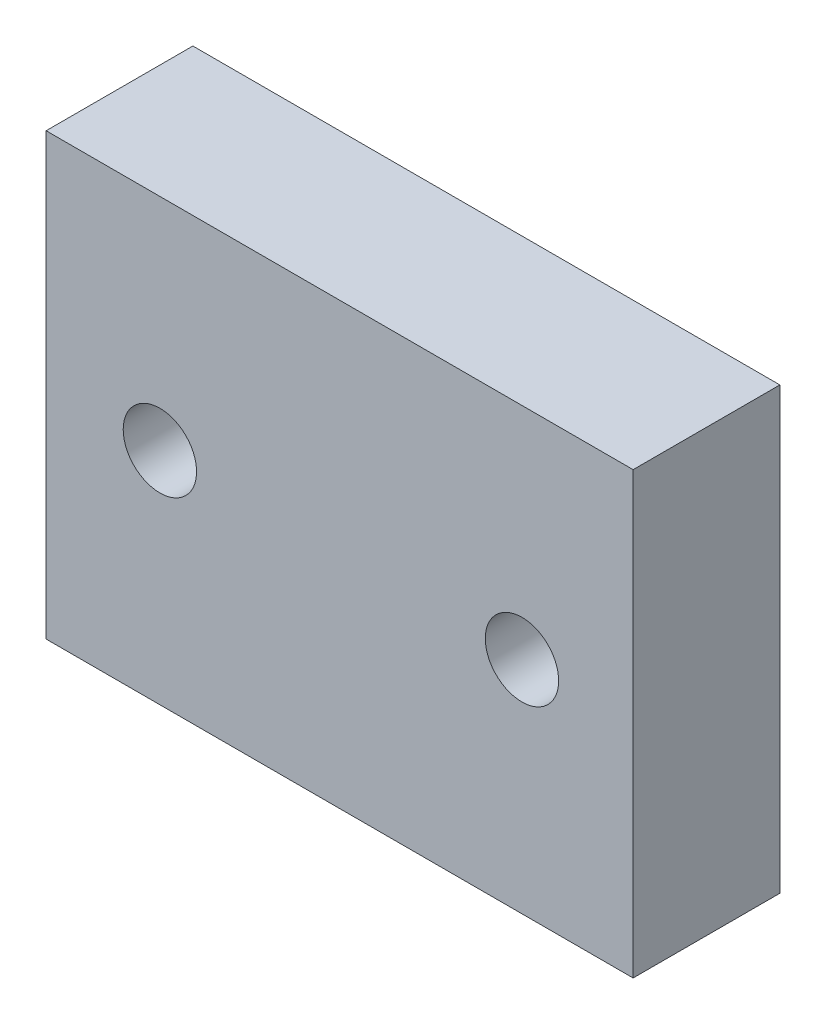
ISO-10303-21;
HEADER;
FILE_DESCRIPTION(('STEP AP214'),'2;1');
FILE_NAME('part.step','',(''),(''),'','','');
FILE_SCHEMA(('AUTOMOTIVE_DESIGN { 1 0 10303 214 1 1 1 1 }'));
ENDSEC;
DATA;
#1=APPLICATION_CONTEXT('core data for automotive mechanical design processes');
#2=APPLICATION_PROTOCOL_DEFINITION('international standard','automotive_design',2000,#1);
#3=PRODUCT_CONTEXT('',#1,'mechanical');
#4=PRODUCT('Part','Part','',(#3));
#5=PRODUCT_RELATED_PRODUCT_CATEGORY('part','',(#4));
#6=PRODUCT_DEFINITION_FORMATION('','',#4);
#7=PRODUCT_DEFINITION_CONTEXT('part definition',#1,'design');
#8=PRODUCT_DEFINITION('design','',#6,#7);
#9=PRODUCT_DEFINITION_SHAPE('','',#8);
#10=(LENGTH_UNIT() NAMED_UNIT(*) SI_UNIT(.MILLI.,.METRE.));
#11=(NAMED_UNIT(*) PLANE_ANGLE_UNIT() SI_UNIT($,.RADIAN.));
#12=(NAMED_UNIT(*) SI_UNIT($,.STERADIAN.) SOLID_ANGLE_UNIT());
#13=UNCERTAINTY_MEASURE_WITH_UNIT(LENGTH_MEASURE(1.E-05),#10,'distance_accuracy_value','');
#14=(GEOMETRIC_REPRESENTATION_CONTEXT(3) GLOBAL_UNCERTAINTY_ASSIGNED_CONTEXT((#13)) GLOBAL_UNIT_ASSIGNED_CONTEXT((#10,
#11,#12)) REPRESENTATION_CONTEXT('',''));
#15=CARTESIAN_POINT('',(0.,0.,0.));
#16=DIRECTION('',(0.,0.,1.));
#17=DIRECTION('',(1.,0.,0.));
#18=AXIS2_PLACEMENT_3D('',#15,#16,#17);
#19=CARTESIAN_POINT('',(-67.7461410245669,15.,40.));
#20=DIRECTION('',(0.,0.,-1.));
#21=DIRECTION('',(-1.,0.,0.));
#22=AXIS2_PLACEMENT_3D('',#19,#20,#21);
#23=CYLINDRICAL_SURFACE('',#22,2.50000000000001);
#24=CARTESIAN_POINT('',(-67.7461410245669,15.,-17.5));
#25=DIRECTION('',(0.,0.,-1.));
#26=DIRECTION('',(-1.,0.,0.));
#27=AXIS2_PLACEMENT_3D('',#24,#25,#26);
#28=CIRCLE('',#27,2.50000000000001);
#29=CARTESIAN_POINT('',(-70.2461410245669,15.,-17.5));
#30=VERTEX_POINT('',#29);
#31=EDGE_CURVE('E277',#30,#30,#28,.T.);
#32=ORIENTED_EDGE('',*,*,#31,.F.);
#33=EDGE_LOOP('',(#32));
#34=FACE_BOUND('',#33,.T.);
#35=CARTESIAN_POINT('',(-67.7461410245669,15.,-24.5));
#36=DIRECTION('',(0.,0.,-1.));
#37=DIRECTION('',(-1.,0.,0.));
#38=AXIS2_PLACEMENT_3D('',#35,#36,#37);
#39=CIRCLE('',#38,2.50000000000001);
#40=CARTESIAN_POINT('',(-70.2461410245669,15.,-24.5));
#41=VERTEX_POINT('',#40);
#42=EDGE_CURVE('E37',#41,#41,#39,.F.);
#43=ORIENTED_EDGE('',*,*,#42,.F.);
#44=EDGE_LOOP('',(#43));
#45=FACE_BOUND('',#44,.T.);
#46=ADVANCED_FACE('F33',(#34,#45),#23,.F.);
#47=CARTESIAN_POINT('',(-43.0740192619808,15.,40.));
#48=DIRECTION('',(0.,0.,-1.));
#49=DIRECTION('',(-1.,0.,0.));
#50=AXIS2_PLACEMENT_3D('',#47,#48,#49);
#51=CYLINDRICAL_SURFACE('',#50,2.5);
#52=CARTESIAN_POINT('',(-43.0740192619808,15.,-17.5));
#53=DIRECTION('',(0.,0.,-1.));
#54=DIRECTION('',(-1.,0.,0.));
#55=AXIS2_PLACEMENT_3D('',#52,#53,#54);
#56=CIRCLE('',#55,2.5);
#57=CARTESIAN_POINT('',(-45.5740192619808,15.,-17.5));
#58=VERTEX_POINT('',#57);
#59=EDGE_CURVE('E265',#58,#58,#56,.T.);
#60=ORIENTED_EDGE('',*,*,#59,.F.);
#61=EDGE_LOOP('',(#60));
#62=FACE_BOUND('',#61,.T.);
#63=CARTESIAN_POINT('',(-43.0740192619808,15.,-24.5));
#64=DIRECTION('',(0.,0.,-1.));
#65=DIRECTION('',(-1.,0.,0.));
#66=AXIS2_PLACEMENT_3D('',#63,#64,#65);
#67=CIRCLE('',#66,2.5);
#68=CARTESIAN_POINT('',(-45.5740192619808,15.,-24.5));
#69=VERTEX_POINT('',#68);
#70=EDGE_CURVE('E197',#69,#69,#67,.F.);
#71=ORIENTED_EDGE('',*,*,#70,.F.);
#72=EDGE_LOOP('',(#71));
#73=FACE_BOUND('',#72,.T.);
#74=ADVANCED_FACE('F289',(#62,#73),#51,.F.);
#75=CARTESIAN_POINT('',(-75.4989459475582,0.,-27.5));
#76=DIRECTION('',(1.,0.,0.));
#77=DIRECTION('',(0.,0.,-1.));
#78=AXIS2_PLACEMENT_3D('',#75,#76,#77);
#79=PLANE('',#78);
#80=DIRECTION('',(0.,1.,0.));
#81=VECTOR('',#80,1.);
#82=CARTESIAN_POINT('',(-75.4989459475582,0.,-17.5));
#83=LINE('',#82,#81);
#84=CARTESIAN_POINT('',(-75.4989459475582,0.,-17.5));
#85=VERTEX_POINT('',#84);
#86=CARTESIAN_POINT('',(-75.4989459475582,30.,-17.5));
#87=VERTEX_POINT('',#86);
#88=EDGE_CURVE('E261',#85,#87,#83,.T.);
#89=ORIENTED_EDGE('',*,*,#88,.T.);
#90=DIRECTION('',(0.,0.,1.));
#91=VECTOR('',#90,1.);
#92=CARTESIAN_POINT('',(-75.4989459475582,30.,-27.5));
#93=LINE('',#92,#91);
#94=CARTESIAN_POINT('',(-75.4989459475582,30.,-27.5));
#95=VERTEX_POINT('',#94);
#96=EDGE_CURVE('E11',#95,#87,#93,.T.);
#97=ORIENTED_EDGE('',*,*,#96,.F.);
#98=DIRECTION('',(0.,1.,0.));
#99=VECTOR('',#98,1.);
#100=CARTESIAN_POINT('',(-75.4989459475582,0.,-27.5));
#101=LINE('',#100,#99);
#102=CARTESIAN_POINT('',(-75.4989459475582,0.,-27.5));
#103=VERTEX_POINT('',#102);
#104=EDGE_CURVE('E250',#103,#95,#101,.T.);
#105=ORIENTED_EDGE('',*,*,#104,.F.);
#106=DIRECTION('',(0.,0.,1.));
#107=VECTOR('',#106,1.);
#108=CARTESIAN_POINT('',(-75.4989459475582,0.,-27.5));
#109=LINE('',#108,#107);
#110=EDGE_CURVE('E260',#103,#85,#109,.T.);
#111=ORIENTED_EDGE('',*,*,#110,.T.);
#112=EDGE_LOOP('',(#89,#97,#105,#111));
#113=FACE_BOUND('',#112,.T.);
#114=ADVANCED_FACE('F35',(#113),#79,.F.);
#115=CARTESIAN_POINT('',(-75.4989459475582,30.,-27.5));
#116=DIRECTION('',(0.,-1.,0.));
#117=DIRECTION('',(0.,0.,-1.));
#118=AXIS2_PLACEMENT_3D('',#115,#116,#117);
#119=PLANE('',#118);
#120=DIRECTION('',(1.,0.,0.));
#121=VECTOR('',#120,1.);
#122=CARTESIAN_POINT('',(-75.4989459475582,30.,-17.5));
#123=LINE('',#122,#121);
#124=CARTESIAN_POINT('',(-35.4989459475582,30.,-17.5));
#125=VERTEX_POINT('',#124);
#126=EDGE_CURVE('E264',#87,#125,#123,.T.);
#127=ORIENTED_EDGE('',*,*,#126,.T.);
#128=DIRECTION('',(0.,0.,1.));
#129=VECTOR('',#128,1.);
#130=CARTESIAN_POINT('',(-35.4989459475582,30.,-27.5));
#131=LINE('',#130,#129);
#132=CARTESIAN_POINT('',(-35.4989459475582,30.,-27.5));
#133=VERTEX_POINT('',#132);
#134=EDGE_CURVE('E42',#133,#125,#131,.T.);
#135=ORIENTED_EDGE('',*,*,#134,.F.);
#136=DIRECTION('',(1.,0.,0.));
#137=VECTOR('',#136,1.);
#138=CARTESIAN_POINT('',(-75.4989459475582,30.,-27.5));
#139=LINE('',#138,#137);
#140=EDGE_CURVE('E253',#95,#133,#139,.T.);
#141=ORIENTED_EDGE('',*,*,#140,.F.);
#142=ORIENTED_EDGE('',*,*,#96,.T.);
#143=EDGE_LOOP('',(#127,#135,#141,#142));
#144=FACE_BOUND('',#143,.T.);
#145=ADVANCED_FACE('F314',(#144),#119,.F.);
#146=CARTESIAN_POINT('',(-35.4989459475582,30.,-27.5));
#147=DIRECTION('',(-1.,0.,0.));
#148=DIRECTION('',(0.,0.,1.));
#149=AXIS2_PLACEMENT_3D('',#146,#147,#148);
#150=PLANE('',#149);
#151=DIRECTION('',(0.,-1.,0.));
#152=VECTOR('',#151,1.);
#153=CARTESIAN_POINT('',(-35.4989459475582,30.,-17.5));
#154=LINE('',#153,#152);
#155=CARTESIAN_POINT('',(-35.4989459475582,0.,-17.5));
#156=VERTEX_POINT('',#155);
#157=EDGE_CURVE('E267',#125,#156,#154,.T.);
#158=ORIENTED_EDGE('',*,*,#157,.T.);
#159=DIRECTION('',(0.,0.,1.));
#160=VECTOR('',#159,1.);
#161=CARTESIAN_POINT('',(-35.4989459475582,0.,-27.5));
#162=LINE('',#161,#160);
#163=CARTESIAN_POINT('',(-35.4989459475582,0.,-27.5));
#164=VERTEX_POINT('',#163);
#165=EDGE_CURVE('E272',#164,#156,#162,.T.);
#166=ORIENTED_EDGE('',*,*,#165,.F.);
#167=DIRECTION('',(0.,-1.,0.));
#168=VECTOR('',#167,1.);
#169=CARTESIAN_POINT('',(-35.4989459475582,30.,-27.5));
#170=LINE('',#169,#168);
#171=EDGE_CURVE('E256',#133,#164,#170,.T.);
#172=ORIENTED_EDGE('',*,*,#171,.F.);
#173=ORIENTED_EDGE('',*,*,#134,.T.);
#174=EDGE_LOOP('',(#158,#166,#172,#173));
#175=FACE_BOUND('',#174,.T.);
#176=ADVANCED_FACE('F311',(#175),#150,.F.);
#177=CARTESIAN_POINT('',(-35.4989459475582,0.,-27.5));
#178=DIRECTION('',(0.,1.,0.));
#179=DIRECTION('',(-1.,0.,0.));
#180=AXIS2_PLACEMENT_3D('',#177,#178,#179);
#181=PLANE('',#180);
#182=DIRECTION('',(-1.,0.,0.));
#183=VECTOR('',#182,1.);
#184=CARTESIAN_POINT('',(-35.4989459475582,0.,-17.5));
#185=LINE('',#184,#183);
#186=EDGE_CURVE('E254',#156,#85,#185,.T.);
#187=ORIENTED_EDGE('',*,*,#186,.T.);
#188=ORIENTED_EDGE('',*,*,#110,.F.);
#189=DIRECTION('',(-1.,0.,0.));
#190=VECTOR('',#189,1.);
#191=CARTESIAN_POINT('',(-35.4989459475582,0.,-27.5));
#192=LINE('',#191,#190);
#193=EDGE_CURVE('E258',#164,#103,#192,.T.);
#194=ORIENTED_EDGE('',*,*,#193,.F.);
#195=ORIENTED_EDGE('',*,*,#165,.T.);
#196=EDGE_LOOP('',(#187,#188,#194,#195));
#197=FACE_BOUND('',#196,.T.);
#198=ADVANCED_FACE('F304',(#197),#181,.F.);
#199=CARTESIAN_POINT('',(0.,0.,-27.5));
#200=DIRECTION('',(0.,0.,-1.));
#201=DIRECTION('',(-1.,0.,0.));
#202=AXIS2_PLACEMENT_3D('',#199,#200,#201);
#203=PLANE('',#202);
#204=DIRECTION('',(-1.,0.,0.));
#205=VECTOR('',#204,1.);
#206=CARTESIAN_POINT('',(-40.7068831583033,10.9,-27.5));
#207=LINE('',#206,#205);
#208=CARTESIAN_POINT('',(-40.7068831583033,10.9,-27.5));
#209=VERTEX_POINT('',#208);
#210=CARTESIAN_POINT('',(-45.4411553656583,10.9,-27.5));
#211=VERTEX_POINT('',#210);
#212=EDGE_CURVE('E50',#209,#211,#207,.T.);
#213=ORIENTED_EDGE('',*,*,#212,.F.);
#214=DIRECTION('',(-0.499999999999999,-0.866025403784439,0.));
#215=VECTOR('',#214,1.);
#216=CARTESIAN_POINT('',(-38.3397470546259,15.,-27.5));
#217=LINE('',#216,#215);
#218=CARTESIAN_POINT('',(-38.3397470546259,15.,-27.5));
#219=VERTEX_POINT('',#218);
#220=EDGE_CURVE('E170',#219,#209,#217,.T.);
#221=ORIENTED_EDGE('',*,*,#220,.F.);
#222=DIRECTION('',(0.5,-0.866025403784439,0.));
#223=VECTOR('',#222,1.);
#224=CARTESIAN_POINT('',(-40.7068831583033,19.1,-27.5));
#225=LINE('',#224,#223);
#226=CARTESIAN_POINT('',(-40.7068831583033,19.1,-27.5));
#227=VERTEX_POINT('',#226);
#228=EDGE_CURVE('E173',#227,#219,#225,.T.);
#229=ORIENTED_EDGE('',*,*,#228,.F.);
#230=DIRECTION('',(1.,0.,0.));
#231=VECTOR('',#230,1.);
#232=CARTESIAN_POINT('',(-45.4411553656583,19.1,-27.5));
#233=LINE('',#232,#231);
#234=CARTESIAN_POINT('',(-45.4411553656583,19.1,-27.5));
#235=VERTEX_POINT('',#234);
#236=EDGE_CURVE('E190',#235,#227,#233,.T.);
#237=ORIENTED_EDGE('',*,*,#236,.F.);
#238=DIRECTION('',(0.500000000000001,0.866025403784438,0.));
#239=VECTOR('',#238,1.);
#240=CARTESIAN_POINT('',(-47.8082914693357,15.,-27.5));
#241=LINE('',#240,#239);
#242=CARTESIAN_POINT('',(-47.8082914693357,15.,-27.5));
#243=VERTEX_POINT('',#242);
#244=EDGE_CURVE('E187',#243,#235,#241,.T.);
#245=ORIENTED_EDGE('',*,*,#244,.F.);
#246=DIRECTION('',(-0.5,0.866025403784438,0.));
#247=VECTOR('',#246,1.);
#248=CARTESIAN_POINT('',(-45.4411553656583,10.9,-27.5));
#249=LINE('',#248,#247);
#250=EDGE_CURVE('E184',#211,#243,#249,.T.);
#251=ORIENTED_EDGE('',*,*,#250,.F.);
#252=EDGE_LOOP('',(#213,#221,#229,#237,#245,#251));
#253=FACE_BOUND('',#252,.T.);
#254=DIRECTION('',(-1.,0.,0.));
#255=VECTOR('',#254,1.);
#256=CARTESIAN_POINT('',(-65.3790049208895,10.9,-27.5));
#257=LINE('',#256,#255);
#258=CARTESIAN_POINT('',(-65.3790049208895,10.9,-27.5));
#259=VERTEX_POINT('',#258);
#260=CARTESIAN_POINT('',(-70.1132771282444,10.9,-27.5));
#261=VERTEX_POINT('',#260);
#262=EDGE_CURVE('E58',#259,#261,#257,.T.);
#263=ORIENTED_EDGE('',*,*,#262,.F.);
#264=DIRECTION('',(-0.500000000000001,-0.866025403784438,0.));
#265=VECTOR('',#264,1.);
#266=CARTESIAN_POINT('',(-63.011868817212,15.,-27.5));
#267=LINE('',#266,#265);
#268=CARTESIAN_POINT('',(-63.011868817212,15.,-27.5));
#269=VERTEX_POINT('',#268);
#270=EDGE_CURVE('E209',#269,#259,#267,.T.);
#271=ORIENTED_EDGE('',*,*,#270,.F.);
#272=DIRECTION('',(0.500000000000001,-0.866025403784438,0.));
#273=VECTOR('',#272,1.);
#274=CARTESIAN_POINT('',(-65.3790049208895,19.1,-27.5));
#275=LINE('',#274,#273);
#276=CARTESIAN_POINT('',(-65.3790049208895,19.1,-27.5));
#277=VERTEX_POINT('',#276);
#278=EDGE_CURVE('E235',#277,#269,#275,.T.);
#279=ORIENTED_EDGE('',*,*,#278,.F.);
#280=DIRECTION('',(1.,0.,0.));
#281=VECTOR('',#280,1.);
#282=CARTESIAN_POINT('',(-70.1132771282443,19.1,-27.5));
#283=LINE('',#282,#281);
#284=CARTESIAN_POINT('',(-70.1132771282443,19.1,-27.5));
#285=VERTEX_POINT('',#284);
#286=EDGE_CURVE('E232',#285,#277,#283,.T.);
#287=ORIENTED_EDGE('',*,*,#286,.F.);
#288=DIRECTION('',(0.5,0.866025403784438,0.));
#289=VECTOR('',#288,1.);
#290=CARTESIAN_POINT('',(-72.4804132319218,15.,-27.5));
#291=LINE('',#290,#289);
#292=CARTESIAN_POINT('',(-72.4804132319218,15.,-27.5));
#293=VERTEX_POINT('',#292);
#294=EDGE_CURVE('E229',#293,#285,#291,.T.);
#295=ORIENTED_EDGE('',*,*,#294,.F.);
#296=DIRECTION('',(-0.5,0.866025403784439,0.));
#297=VECTOR('',#296,1.);
#298=CARTESIAN_POINT('',(-70.1132771282444,10.9,-27.5));
#299=LINE('',#298,#297);
#300=EDGE_CURVE('E226',#261,#293,#299,.T.);
#301=ORIENTED_EDGE('',*,*,#300,.F.);
#302=EDGE_LOOP('',(#263,#271,#279,#287,#295,#301));
#303=FACE_BOUND('',#302,.T.);
#304=ORIENTED_EDGE('',*,*,#104,.T.);
#305=ORIENTED_EDGE('',*,*,#140,.T.);
#306=ORIENTED_EDGE('',*,*,#171,.T.);
#307=ORIENTED_EDGE('',*,*,#193,.T.);
#308=EDGE_LOOP('',(#304,#305,#306,#307));
#309=FACE_BOUND('',#308,.T.);
#310=ADVANCED_FACE('F300',(#253,#303,#309),#203,.T.);
#311=CARTESIAN_POINT('',(0.,0.,-17.5));
#312=DIRECTION('',(0.,0.,-1.));
#313=DIRECTION('',(-1.,0.,0.));
#314=AXIS2_PLACEMENT_3D('',#311,#312,#313);
#315=PLANE('',#314);
#316=ORIENTED_EDGE('',*,*,#59,.T.);
#317=EDGE_LOOP('',(#316));
#318=FACE_BOUND('',#317,.T.);
#319=ORIENTED_EDGE('',*,*,#31,.T.);
#320=EDGE_LOOP('',(#319));
#321=FACE_BOUND('',#320,.T.);
#322=ORIENTED_EDGE('',*,*,#88,.F.);
#323=ORIENTED_EDGE('',*,*,#186,.F.);
#324=ORIENTED_EDGE('',*,*,#157,.F.);
#325=ORIENTED_EDGE('',*,*,#126,.F.);
#326=EDGE_LOOP('',(#322,#323,#324,#325));
#327=FACE_BOUND('',#326,.T.);
#328=ADVANCED_FACE('F303',(#318,#321,#327),#315,.F.);
#329=CARTESIAN_POINT('',(0.,0.,-24.5000000000001));
#330=DIRECTION('',(0.,0.,-1.));
#331=DIRECTION('',(-1.,0.,0.));
#332=AXIS2_PLACEMENT_3D('',#329,#330,#331);
#333=PLANE('',#332);
#334=DIRECTION('',(-1.,0.,0.));
#335=VECTOR('',#334,1.);
#336=CARTESIAN_POINT('',(-40.7068831583033,10.9,-24.5));
#337=LINE('',#336,#335);
#338=CARTESIAN_POINT('',(-40.7068831583033,10.9,-24.5));
#339=VERTEX_POINT('',#338);
#340=CARTESIAN_POINT('',(-45.4411553656583,10.9,-24.5));
#341=VERTEX_POINT('',#340);
#342=EDGE_CURVE('E150',#339,#341,#337,.T.);
#343=ORIENTED_EDGE('',*,*,#342,.T.);
#344=DIRECTION('',(-0.5,0.866025403784438,0.));
#345=VECTOR('',#344,1.);
#346=CARTESIAN_POINT('',(-45.4411553656583,10.9,-24.5));
#347=LINE('',#346,#345);
#348=CARTESIAN_POINT('',(-47.8082914693357,15.,-24.5));
#349=VERTEX_POINT('',#348);
#350=EDGE_CURVE('E159',#341,#349,#347,.T.);
#351=ORIENTED_EDGE('',*,*,#350,.T.);
#352=DIRECTION('',(0.500000000000001,0.866025403784438,0.));
#353=VECTOR('',#352,1.);
#354=CARTESIAN_POINT('',(-47.8082914693357,15.,-24.5));
#355=LINE('',#354,#353);
#356=CARTESIAN_POINT('',(-45.4411553656583,19.1,-24.5));
#357=VERTEX_POINT('',#356);
#358=EDGE_CURVE('E164',#349,#357,#355,.T.);
#359=ORIENTED_EDGE('',*,*,#358,.T.);
#360=DIRECTION('',(1.,0.,0.));
#361=VECTOR('',#360,1.);
#362=CARTESIAN_POINT('',(-45.4411553656583,19.1,-24.5));
#363=LINE('',#362,#361);
#364=CARTESIAN_POINT('',(-40.7068831583033,19.1,-24.5));
#365=VERTEX_POINT('',#364);
#366=EDGE_CURVE('E177',#357,#365,#363,.T.);
#367=ORIENTED_EDGE('',*,*,#366,.T.);
#368=DIRECTION('',(0.5,-0.866025403784439,0.));
#369=VECTOR('',#368,1.);
#370=CARTESIAN_POINT('',(-40.7068831583033,19.1,-24.5));
#371=LINE('',#370,#369);
#372=CARTESIAN_POINT('',(-38.3397470546259,15.,-24.5));
#373=VERTEX_POINT('',#372);
#374=EDGE_CURVE('E180',#365,#373,#371,.T.);
#375=ORIENTED_EDGE('',*,*,#374,.T.);
#376=DIRECTION('',(-0.499999999999999,-0.866025403784439,0.));
#377=VECTOR('',#376,1.);
#378=CARTESIAN_POINT('',(-38.3397470546259,15.,-24.5));
#379=LINE('',#378,#377);
#380=EDGE_CURVE('E156',#373,#339,#379,.T.);
#381=ORIENTED_EDGE('',*,*,#380,.T.);
#382=EDGE_LOOP('',(#343,#351,#359,#367,#375,#381));
#383=FACE_BOUND('',#382,.T.);
#384=ORIENTED_EDGE('',*,*,#70,.T.);
#385=EDGE_LOOP('',(#384));
#386=FACE_BOUND('',#385,.T.);
#387=ADVANCED_FACE('F166',(#383,#386),#333,.T.);
#388=CARTESIAN_POINT('',(-40.7068831583033,10.9,-24.5));
#389=DIRECTION('',(0.,-1.,0.));
#390=DIRECTION('',(0.,0.,-1.));
#391=AXIS2_PLACEMENT_3D('',#388,#389,#390);
#392=PLANE('',#391);
#393=ORIENTED_EDGE('',*,*,#212,.T.);
#394=DIRECTION('',(0.,0.,-1.));
#395=VECTOR('',#394,1.);
#396=CARTESIAN_POINT('',(-45.4411553656583,10.9,-24.5));
#397=LINE('',#396,#395);
#398=EDGE_CURVE('E146',#341,#211,#397,.T.);
#399=ORIENTED_EDGE('',*,*,#398,.F.);
#400=ORIENTED_EDGE('',*,*,#342,.F.);
#401=DIRECTION('',(0.,0.,-1.));
#402=VECTOR('',#401,1.);
#403=CARTESIAN_POINT('',(-40.7068831583033,10.9,-24.5));
#404=LINE('',#403,#402);
#405=EDGE_CURVE('E195',#339,#209,#404,.T.);
#406=ORIENTED_EDGE('',*,*,#405,.T.);
#407=EDGE_LOOP('',(#393,#399,#400,#406));
#408=FACE_BOUND('',#407,.T.);
#409=ADVANCED_FACE('F148',(#408),#392,.F.);
#410=CARTESIAN_POINT('',(-38.3397470546259,15.,-24.5));
#411=DIRECTION('',(0.866025403784439,-0.499999999999999,0.));
#412=DIRECTION('',(0.499999999999999,0.866025403784439,0.));
#413=AXIS2_PLACEMENT_3D('',#410,#411,#412);
#414=PLANE('',#413);
#415=ORIENTED_EDGE('',*,*,#220,.T.);
#416=ORIENTED_EDGE('',*,*,#405,.F.);
#417=ORIENTED_EDGE('',*,*,#380,.F.);
#418=DIRECTION('',(0.,0.,-1.));
#419=VECTOR('',#418,1.);
#420=CARTESIAN_POINT('',(-38.3397470546259,15.,-24.5));
#421=LINE('',#420,#419);
#422=EDGE_CURVE('E198',#373,#219,#421,.T.);
#423=ORIENTED_EDGE('',*,*,#422,.T.);
#424=EDGE_LOOP('',(#415,#416,#417,#423));
#425=FACE_BOUND('',#424,.T.);
#426=ADVANCED_FACE('F386',(#425),#414,.F.);
#427=CARTESIAN_POINT('',(-40.7068831583033,19.1,-24.5));
#428=DIRECTION('',(0.866025403784439,0.5,0.));
#429=DIRECTION('',(-0.5,0.866025403784439,0.));
#430=AXIS2_PLACEMENT_3D('',#427,#428,#429);
#431=PLANE('',#430);
#432=ORIENTED_EDGE('',*,*,#228,.T.);
#433=ORIENTED_EDGE('',*,*,#422,.F.);
#434=ORIENTED_EDGE('',*,*,#374,.F.);
#435=DIRECTION('',(0.,0.,-1.));
#436=VECTOR('',#435,1.);
#437=CARTESIAN_POINT('',(-40.7068831583033,19.1,-24.5));
#438=LINE('',#437,#436);
#439=EDGE_CURVE('E200',#365,#227,#438,.T.);
#440=ORIENTED_EDGE('',*,*,#439,.T.);
#441=EDGE_LOOP('',(#432,#433,#434,#440));
#442=FACE_BOUND('',#441,.T.);
#443=ADVANCED_FACE('F394',(#442),#431,.F.);
#444=CARTESIAN_POINT('',(-45.4411553656583,19.1,-24.5));
#445=DIRECTION('',(0.,1.,0.));
#446=DIRECTION('',(0.,0.,1.));
#447=AXIS2_PLACEMENT_3D('',#444,#445,#446);
#448=PLANE('',#447);
#449=ORIENTED_EDGE('',*,*,#236,.T.);
#450=ORIENTED_EDGE('',*,*,#439,.F.);
#451=ORIENTED_EDGE('',*,*,#366,.F.);
#452=DIRECTION('',(0.,0.,-1.));
#453=VECTOR('',#452,1.);
#454=CARTESIAN_POINT('',(-45.4411553656583,19.1,-24.5));
#455=LINE('',#454,#453);
#456=EDGE_CURVE('E202',#357,#235,#455,.T.);
#457=ORIENTED_EDGE('',*,*,#456,.T.);
#458=EDGE_LOOP('',(#449,#450,#451,#457));
#459=FACE_BOUND('',#458,.T.);
#460=ADVANCED_FACE('F403',(#459),#448,.F.);
#461=CARTESIAN_POINT('',(-47.8082914693357,15.,-24.5));
#462=DIRECTION('',(-0.866025403784438,0.500000000000001,0.));
#463=DIRECTION('',(-0.500000000000001,-0.866025403784438,0.));
#464=AXIS2_PLACEMENT_3D('',#461,#462,#463);
#465=PLANE('',#464);
#466=ORIENTED_EDGE('',*,*,#244,.T.);
#467=ORIENTED_EDGE('',*,*,#456,.F.);
#468=ORIENTED_EDGE('',*,*,#358,.F.);
#469=DIRECTION('',(0.,0.,-1.));
#470=VECTOR('',#469,1.);
#471=CARTESIAN_POINT('',(-47.8082914693357,15.,-24.5));
#472=LINE('',#471,#470);
#473=EDGE_CURVE('E155',#349,#243,#472,.T.);
#474=ORIENTED_EDGE('',*,*,#473,.T.);
#475=EDGE_LOOP('',(#466,#467,#468,#474));
#476=FACE_BOUND('',#475,.T.);
#477=ADVANCED_FACE('F412',(#476),#465,.F.);
#478=CARTESIAN_POINT('',(-45.4411553656583,10.9,-24.5));
#479=DIRECTION('',(-0.866025403784438,-0.5,0.));
#480=DIRECTION('',(0.5,-0.866025403784438,0.));
#481=AXIS2_PLACEMENT_3D('',#478,#479,#480);
#482=PLANE('',#481);
#483=ORIENTED_EDGE('',*,*,#250,.T.);
#484=ORIENTED_EDGE('',*,*,#473,.F.);
#485=ORIENTED_EDGE('',*,*,#350,.F.);
#486=ORIENTED_EDGE('',*,*,#398,.T.);
#487=EDGE_LOOP('',(#483,#484,#485,#486));
#488=FACE_BOUND('',#487,.T.);
#489=ADVANCED_FACE('F160',(#488),#482,.F.);
#490=CARTESIAN_POINT('',(0.,0.,-24.5));
#491=DIRECTION('',(0.,0.,-1.));
#492=DIRECTION('',(-1.,0.,0.));
#493=AXIS2_PLACEMENT_3D('',#490,#491,#492);
#494=PLANE('',#493);
#495=DIRECTION('',(-1.,0.,0.));
#496=VECTOR('',#495,1.);
#497=CARTESIAN_POINT('',(-65.3790049208895,10.9,-24.5));
#498=LINE('',#497,#496);
#499=CARTESIAN_POINT('',(-65.3790049208895,10.9,-24.5));
#500=VERTEX_POINT('',#499);
#501=CARTESIAN_POINT('',(-70.1132771282444,10.9,-24.5));
#502=VERTEX_POINT('',#501);
#503=EDGE_CURVE('E205',#500,#502,#498,.T.);
#504=ORIENTED_EDGE('',*,*,#503,.T.);
#505=DIRECTION('',(-0.5,0.866025403784439,0.));
#506=VECTOR('',#505,1.);
#507=CARTESIAN_POINT('',(-70.1132771282444,10.9,-24.5));
#508=LINE('',#507,#506);
#509=CARTESIAN_POINT('',(-72.4804132319218,15.,-24.5));
#510=VERTEX_POINT('',#509);
#511=EDGE_CURVE('E208',#502,#510,#508,.T.);
#512=ORIENTED_EDGE('',*,*,#511,.T.);
#513=DIRECTION('',(0.5,0.866025403784438,0.));
#514=VECTOR('',#513,1.);
#515=CARTESIAN_POINT('',(-72.4804132319218,15.,-24.5));
#516=LINE('',#515,#514);
#517=CARTESIAN_POINT('',(-70.1132771282443,19.1,-24.5));
#518=VERTEX_POINT('',#517);
#519=EDGE_CURVE('E212',#510,#518,#516,.T.);
#520=ORIENTED_EDGE('',*,*,#519,.T.);
#521=DIRECTION('',(1.,0.,0.));
#522=VECTOR('',#521,1.);
#523=CARTESIAN_POINT('',(-70.1132771282443,19.1,-24.5));
#524=LINE('',#523,#522);
#525=CARTESIAN_POINT('',(-65.3790049208895,19.1,-24.5));
#526=VERTEX_POINT('',#525);
#527=EDGE_CURVE('E215',#518,#526,#524,.T.);
#528=ORIENTED_EDGE('',*,*,#527,.T.);
#529=DIRECTION('',(0.500000000000001,-0.866025403784438,0.));
#530=VECTOR('',#529,1.);
#531=CARTESIAN_POINT('',(-65.3790049208895,19.1,-24.5));
#532=LINE('',#531,#530);
#533=CARTESIAN_POINT('',(-63.011868817212,15.,-24.5));
#534=VERTEX_POINT('',#533);
#535=EDGE_CURVE('E218',#526,#534,#532,.T.);
#536=ORIENTED_EDGE('',*,*,#535,.T.);
#537=DIRECTION('',(-0.500000000000001,-0.866025403784438,0.));
#538=VECTOR('',#537,1.);
#539=CARTESIAN_POINT('',(-63.011868817212,15.,-24.5));
#540=LINE('',#539,#538);
#541=EDGE_CURVE('E221',#534,#500,#540,.T.);
#542=ORIENTED_EDGE('',*,*,#541,.T.);
#543=EDGE_LOOP('',(#504,#512,#520,#528,#536,#542));
#544=FACE_BOUND('',#543,.T.);
#545=ORIENTED_EDGE('',*,*,#42,.T.);
#546=EDGE_LOOP('',(#545));
#547=FACE_BOUND('',#546,.T.);
#548=ADVANCED_FACE('F286',(#544,#547),#494,.T.);
#549=CARTESIAN_POINT('',(-65.3790049208895,10.9,-24.5));
#550=DIRECTION('',(0.,-1.,0.));
#551=DIRECTION('',(0.,0.,-1.));
#552=AXIS2_PLACEMENT_3D('',#549,#550,#551);
#553=PLANE('',#552);
#554=ORIENTED_EDGE('',*,*,#262,.T.);
#555=DIRECTION('',(0.,0.,-1.));
#556=VECTOR('',#555,1.);
#557=CARTESIAN_POINT('',(-70.1132771282444,10.9,-24.5));
#558=LINE('',#557,#556);
#559=EDGE_CURVE('E224',#502,#261,#558,.T.);
#560=ORIENTED_EDGE('',*,*,#559,.F.);
#561=ORIENTED_EDGE('',*,*,#503,.F.);
#562=DIRECTION('',(0.,0.,-1.));
#563=VECTOR('',#562,1.);
#564=CARTESIAN_POINT('',(-65.3790049208895,10.9,-24.5));
#565=LINE('',#564,#563);
#566=EDGE_CURVE('E185',#500,#259,#565,.T.);
#567=ORIENTED_EDGE('',*,*,#566,.T.);
#568=EDGE_LOOP('',(#554,#560,#561,#567));
#569=FACE_BOUND('',#568,.T.);
#570=ADVANCED_FACE('F436',(#569),#553,.F.);
#571=CARTESIAN_POINT('',(-63.011868817212,15.,-24.5));
#572=DIRECTION('',(0.866025403784438,-0.500000000000001,0.));
#573=DIRECTION('',(0.500000000000001,0.866025403784438,0.));
#574=AXIS2_PLACEMENT_3D('',#571,#572,#573);
#575=PLANE('',#574);
#576=ORIENTED_EDGE('',*,*,#270,.T.);
#577=ORIENTED_EDGE('',*,*,#566,.F.);
#578=ORIENTED_EDGE('',*,*,#541,.F.);
#579=DIRECTION('',(0.,0.,-1.));
#580=VECTOR('',#579,1.);
#581=CARTESIAN_POINT('',(-63.011868817212,15.,-24.5));
#582=LINE('',#581,#580);
#583=EDGE_CURVE('E241',#534,#269,#582,.T.);
#584=ORIENTED_EDGE('',*,*,#583,.T.);
#585=EDGE_LOOP('',(#576,#577,#578,#584));
#586=FACE_BOUND('',#585,.T.);
#587=ADVANCED_FACE('F445',(#586),#575,.F.);
#588=CARTESIAN_POINT('',(-65.3790049208895,19.1,-24.5));
#589=DIRECTION('',(0.866025403784438,0.500000000000001,0.));
#590=DIRECTION('',(-0.500000000000001,0.866025403784438,0.));
#591=AXIS2_PLACEMENT_3D('',#588,#589,#590);
#592=PLANE('',#591);
#593=ORIENTED_EDGE('',*,*,#278,.T.);
#594=ORIENTED_EDGE('',*,*,#583,.F.);
#595=ORIENTED_EDGE('',*,*,#535,.F.);
#596=DIRECTION('',(0.,0.,-1.));
#597=VECTOR('',#596,1.);
#598=CARTESIAN_POINT('',(-65.3790049208895,19.1,-24.5));
#599=LINE('',#598,#597);
#600=EDGE_CURVE('E243',#526,#277,#599,.T.);
#601=ORIENTED_EDGE('',*,*,#600,.T.);
#602=EDGE_LOOP('',(#593,#594,#595,#601));
#603=FACE_BOUND('',#602,.T.);
#604=ADVANCED_FACE('F452',(#603),#592,.F.);
#605=CARTESIAN_POINT('',(-70.1132771282443,19.1,-24.5));
#606=DIRECTION('',(0.,1.,0.));
#607=DIRECTION('',(0.,0.,1.));
#608=AXIS2_PLACEMENT_3D('',#605,#606,#607);
#609=PLANE('',#608);
#610=ORIENTED_EDGE('',*,*,#286,.T.);
#611=ORIENTED_EDGE('',*,*,#600,.F.);
#612=ORIENTED_EDGE('',*,*,#527,.F.);
#613=DIRECTION('',(0.,0.,-1.));
#614=VECTOR('',#613,1.);
#615=CARTESIAN_POINT('',(-70.1132771282443,19.1,-24.5));
#616=LINE('',#615,#614);
#617=EDGE_CURVE('E245',#518,#285,#616,.T.);
#618=ORIENTED_EDGE('',*,*,#617,.T.);
#619=EDGE_LOOP('',(#610,#611,#612,#618));
#620=FACE_BOUND('',#619,.T.);
#621=ADVANCED_FACE('F461',(#620),#609,.F.);
#622=CARTESIAN_POINT('',(-72.4804132319218,15.,-24.5));
#623=DIRECTION('',(-0.866025403784438,0.5,0.));
#624=DIRECTION('',(-0.5,-0.866025403784439,0.));
#625=AXIS2_PLACEMENT_3D('',#622,#623,#624);
#626=PLANE('',#625);
#627=ORIENTED_EDGE('',*,*,#294,.T.);
#628=ORIENTED_EDGE('',*,*,#617,.F.);
#629=ORIENTED_EDGE('',*,*,#519,.F.);
#630=DIRECTION('',(0.,0.,-1.));
#631=VECTOR('',#630,1.);
#632=CARTESIAN_POINT('',(-72.4804132319218,15.,-24.5));
#633=LINE('',#632,#631);
#634=EDGE_CURVE('E247',#510,#293,#633,.T.);
#635=ORIENTED_EDGE('',*,*,#634,.T.);
#636=EDGE_LOOP('',(#627,#628,#629,#635));
#637=FACE_BOUND('',#636,.T.);
#638=ADVANCED_FACE('F470',(#637),#626,.F.);
#639=CARTESIAN_POINT('',(-70.1132771282444,10.9,-24.5));
#640=DIRECTION('',(-0.866025403784439,-0.5,0.));
#641=DIRECTION('',(0.5,-0.866025403784439,0.));
#642=AXIS2_PLACEMENT_3D('',#639,#640,#641);
#643=PLANE('',#642);
#644=ORIENTED_EDGE('',*,*,#300,.T.);
#645=ORIENTED_EDGE('',*,*,#634,.F.);
#646=ORIENTED_EDGE('',*,*,#511,.F.);
#647=ORIENTED_EDGE('',*,*,#559,.T.);
#648=EDGE_LOOP('',(#644,#645,#646,#647));
#649=FACE_BOUND('',#648,.T.);
#650=ADVANCED_FACE('F479',(#649),#643,.F.);
#651=CLOSED_SHELL('',(#46,#74,#114,#145,#176,#198,#310,#328,#387,#409,#426,#443,#460,#477,#489,
#548,#570,#587,#604,#621,#638,#650));
#652=MANIFOLD_SOLID_BREP('B2',#651);
#653=ADVANCED_BREP_SHAPE_REPRESENTATION('',(#18,#652),#14);
#654=SHAPE_DEFINITION_REPRESENTATION(#9,#653);
ENDSEC;
END-ISO-10303-21;
